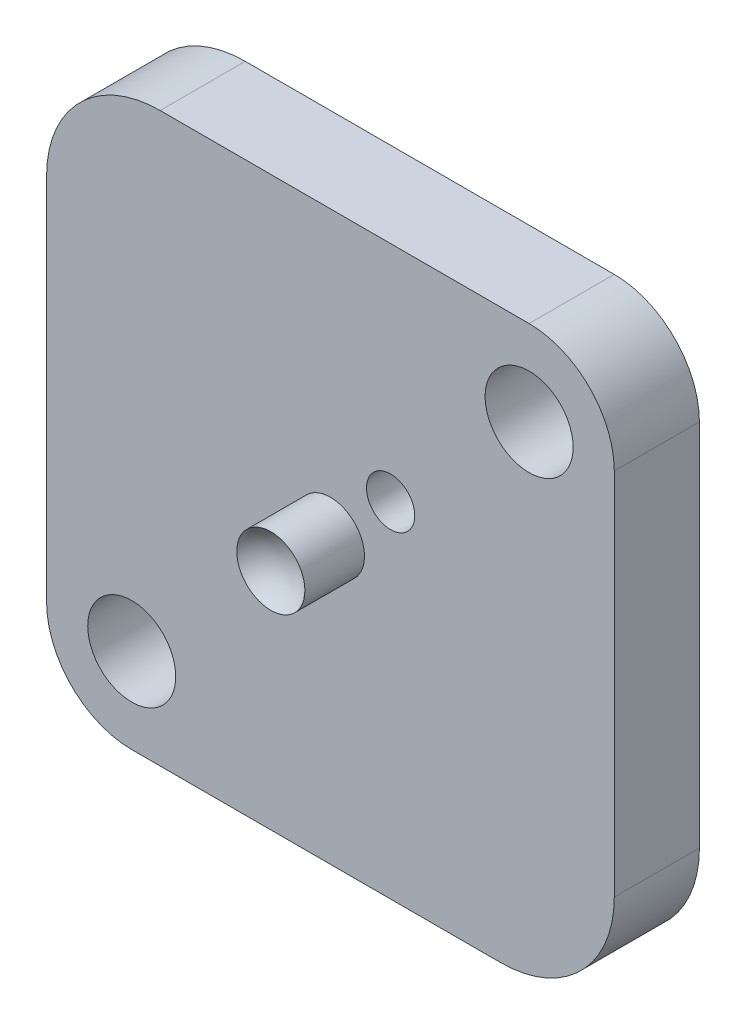
ISO-10303-21;
HEADER;
FILE_DESCRIPTION(('STEP AP214'),'2;1');
FILE_NAME('part.step','',(''),(''),'','','');
FILE_SCHEMA(('AUTOMOTIVE_DESIGN { 1 0 10303 214 1 1 1 1 }'));
ENDSEC;
DATA;
#1=APPLICATION_CONTEXT('core data for automotive mechanical design processes');
#2=APPLICATION_PROTOCOL_DEFINITION('international standard','automotive_design',2000,#1);
#3=PRODUCT_CONTEXT('',#1,'mechanical');
#4=PRODUCT('Part','Part','',(#3));
#5=PRODUCT_RELATED_PRODUCT_CATEGORY('part','',(#4));
#6=PRODUCT_DEFINITION_FORMATION('','',#4);
#7=PRODUCT_DEFINITION_CONTEXT('part definition',#1,'design');
#8=PRODUCT_DEFINITION('design','',#6,#7);
#9=PRODUCT_DEFINITION_SHAPE('','',#8);
#10=(LENGTH_UNIT() NAMED_UNIT(*) SI_UNIT(.MILLI.,.METRE.));
#11=(NAMED_UNIT(*) PLANE_ANGLE_UNIT() SI_UNIT($,.RADIAN.));
#12=(NAMED_UNIT(*) SI_UNIT($,.STERADIAN.) SOLID_ANGLE_UNIT());
#13=UNCERTAINTY_MEASURE_WITH_UNIT(LENGTH_MEASURE(1.E-05),#10,'distance_accuracy_value','');
#14=(GEOMETRIC_REPRESENTATION_CONTEXT(3) GLOBAL_UNCERTAINTY_ASSIGNED_CONTEXT((#13)) GLOBAL_UNIT_ASSIGNED_CONTEXT((#10,
#11,#12)) REPRESENTATION_CONTEXT('',''));
#15=CARTESIAN_POINT('',(0.,0.,0.));
#16=DIRECTION('',(0.,0.,1.));
#17=DIRECTION('',(1.,0.,0.));
#18=AXIS2_PLACEMENT_3D('',#15,#16,#17);
#19=CARTESIAN_POINT('',(-50.,-50.,15.));
#20=DIRECTION('',(1.,0.,0.));
#21=DIRECTION('',(0.,0.,-1.));
#22=AXIS2_PLACEMENT_3D('',#19,#20,#21);
#23=PLANE('',#22);
#24=DIRECTION('',(0.,-1.,0.));
#25=VECTOR('',#24,1.);
#26=CARTESIAN_POINT('',(-50.,-50.,0.));
#27=LINE('',#26,#25);
#28=CARTESIAN_POINT('',(-50.,30.,0.));
#29=VERTEX_POINT('',#28);
#30=CARTESIAN_POINT('',(-50.,-35.,0.));
#31=VERTEX_POINT('',#30);
#32=EDGE_CURVE('E126',#29,#31,#27,.T.);
#33=ORIENTED_EDGE('',*,*,#32,.T.);
#34=DIRECTION('',(0.,0.,-1.));
#35=VECTOR('',#34,1.);
#36=CARTESIAN_POINT('',(-50.,-35.,15.));
#37=LINE('',#36,#35);
#38=CARTESIAN_POINT('',(-50.,-35.,15.));
#39=VERTEX_POINT('',#38);
#40=EDGE_CURVE('E149',#31,#39,#37,.F.);
#41=ORIENTED_EDGE('',*,*,#40,.T.);
#42=DIRECTION('',(0.,-1.,0.));
#43=VECTOR('',#42,1.);
#44=CARTESIAN_POINT('',(-50.,-50.,15.));
#45=LINE('',#44,#43);
#46=CARTESIAN_POINT('',(-50.,30.,15.));
#47=VERTEX_POINT('',#46);
#48=EDGE_CURVE('E124',#47,#39,#45,.T.);
#49=ORIENTED_EDGE('',*,*,#48,.F.);
#50=DIRECTION('',(0.,0.,-1.));
#51=VECTOR('',#50,1.);
#52=CARTESIAN_POINT('',(-50.,30.,15.));
#53=LINE('',#52,#51);
#54=EDGE_CURVE('E137',#47,#29,#53,.T.);
#55=ORIENTED_EDGE('',*,*,#54,.T.);
#56=EDGE_LOOP('',(#33,#41,#49,#55));
#57=FACE_BOUND('',#56,.T.);
#58=ADVANCED_FACE('F34',(#57),#23,.F.);
#59=CARTESIAN_POINT('',(50.,-50.,15.));
#60=DIRECTION('',(0.,1.,0.));
#61=DIRECTION('',(-1.,0.,0.));
#62=AXIS2_PLACEMENT_3D('',#59,#60,#61);
#63=PLANE('',#62);
#64=DIRECTION('',(1.,0.,0.));
#65=VECTOR('',#64,1.);
#66=CARTESIAN_POINT('',(50.,-50.,15.));
#67=LINE('',#66,#65);
#68=CARTESIAN_POINT('',(-35.,-50.,15.));
#69=VERTEX_POINT('',#68);
#70=CARTESIAN_POINT('',(30.,-50.,15.));
#71=VERTEX_POINT('',#70);
#72=EDGE_CURVE('E172',#69,#71,#67,.T.);
#73=ORIENTED_EDGE('',*,*,#72,.F.);
#74=DIRECTION('',(0.,0.,-1.));
#75=VECTOR('',#74,1.);
#76=CARTESIAN_POINT('',(-35.,-50.,15.));
#77=LINE('',#76,#75);
#78=CARTESIAN_POINT('',(-35.,-50.,0.));
#79=VERTEX_POINT('',#78);
#80=EDGE_CURVE('E143',#69,#79,#77,.T.);
#81=ORIENTED_EDGE('',*,*,#80,.T.);
#82=DIRECTION('',(1.,0.,0.));
#83=VECTOR('',#82,1.);
#84=CARTESIAN_POINT('',(50.,-50.,0.));
#85=LINE('',#84,#83);
#86=CARTESIAN_POINT('',(30.,-50.,0.));
#87=VERTEX_POINT('',#86);
#88=EDGE_CURVE('E122',#79,#87,#85,.T.);
#89=ORIENTED_EDGE('',*,*,#88,.T.);
#90=DIRECTION('',(0.,0.,-1.));
#91=VECTOR('',#90,1.);
#92=CARTESIAN_POINT('',(30.,-50.,15.));
#93=LINE('',#92,#91);
#94=EDGE_CURVE('E107',#87,#71,#93,.F.);
#95=ORIENTED_EDGE('',*,*,#94,.T.);
#96=EDGE_LOOP('',(#73,#81,#89,#95));
#97=FACE_BOUND('',#96,.T.);
#98=ADVANCED_FACE('F242',(#97),#63,.F.);
#99=CARTESIAN_POINT('',(50.,-50.,15.));
#100=DIRECTION('',(-1.,0.,0.));
#101=DIRECTION('',(0.,0.,1.));
#102=AXIS2_PLACEMENT_3D('',#99,#100,#101);
#103=PLANE('',#102);
#104=DIRECTION('',(0.,1.,0.));
#105=VECTOR('',#104,1.);
#106=CARTESIAN_POINT('',(50.,-50.,0.));
#107=LINE('',#106,#105);
#108=CARTESIAN_POINT('',(50.,-30.,0.));
#109=VERTEX_POINT('',#108);
#110=CARTESIAN_POINT('',(50.,35.,0.));
#111=VERTEX_POINT('',#110);
#112=EDGE_CURVE('E114',#109,#111,#107,.T.);
#113=ORIENTED_EDGE('',*,*,#112,.T.);
#114=DIRECTION('',(0.,0.,-1.));
#115=VECTOR('',#114,1.);
#116=CARTESIAN_POINT('',(50.,35.,15.));
#117=LINE('',#116,#115);
#118=CARTESIAN_POINT('',(50.,35.,15.));
#119=VERTEX_POINT('',#118);
#120=EDGE_CURVE('E11',#111,#119,#117,.F.);
#121=ORIENTED_EDGE('',*,*,#120,.T.);
#122=DIRECTION('',(0.,1.,0.));
#123=VECTOR('',#122,1.);
#124=CARTESIAN_POINT('',(50.,-50.,15.));
#125=LINE('',#124,#123);
#126=CARTESIAN_POINT('',(50.,-30.,15.));
#127=VERTEX_POINT('',#126);
#128=EDGE_CURVE('E115',#127,#119,#125,.T.);
#129=ORIENTED_EDGE('',*,*,#128,.F.);
#130=DIRECTION('',(0.,0.,-1.));
#131=VECTOR('',#130,1.);
#132=CARTESIAN_POINT('',(50.,-30.,15.));
#133=LINE('',#132,#131);
#134=EDGE_CURVE('E105',#127,#109,#133,.T.);
#135=ORIENTED_EDGE('',*,*,#134,.T.);
#136=EDGE_LOOP('',(#113,#121,#129,#135));
#137=FACE_BOUND('',#136,.T.);
#138=ADVANCED_FACE('F113',(#137),#103,.F.);
#139=CARTESIAN_POINT('',(50.,50.,15.));
#140=DIRECTION('',(0.,-1.,0.));
#141=DIRECTION('',(1.,0.,0.));
#142=AXIS2_PLACEMENT_3D('',#139,#140,#141);
#143=PLANE('',#142);
#144=DIRECTION('',(-1.,0.,0.));
#145=VECTOR('',#144,1.);
#146=CARTESIAN_POINT('',(50.,50.,15.));
#147=LINE('',#146,#145);
#148=CARTESIAN_POINT('',(35.,50.,15.));
#149=VERTEX_POINT('',#148);
#150=CARTESIAN_POINT('',(-30.,50.,15.));
#151=VERTEX_POINT('',#150);
#152=EDGE_CURVE('E116',#149,#151,#147,.T.);
#153=ORIENTED_EDGE('',*,*,#152,.F.);
#154=DIRECTION('',(0.,0.,-1.));
#155=VECTOR('',#154,1.);
#156=CARTESIAN_POINT('',(35.,50.,15.));
#157=LINE('',#156,#155);
#158=CARTESIAN_POINT('',(35.,50.,0.));
#159=VERTEX_POINT('',#158);
#160=EDGE_CURVE('E43',#149,#159,#157,.T.);
#161=ORIENTED_EDGE('',*,*,#160,.T.);
#162=DIRECTION('',(-1.,0.,0.));
#163=VECTOR('',#162,1.);
#164=CARTESIAN_POINT('',(50.,50.,0.));
#165=LINE('',#164,#163);
#166=CARTESIAN_POINT('',(-30.,50.,0.));
#167=VERTEX_POINT('',#166);
#168=EDGE_CURVE('E121',#159,#167,#165,.T.);
#169=ORIENTED_EDGE('',*,*,#168,.T.);
#170=DIRECTION('',(0.,0.,-1.));
#171=VECTOR('',#170,1.);
#172=CARTESIAN_POINT('',(-30.,50.,15.));
#173=LINE('',#172,#171);
#174=EDGE_CURVE('E140',#167,#151,#173,.F.);
#175=ORIENTED_EDGE('',*,*,#174,.T.);
#176=EDGE_LOOP('',(#153,#161,#169,#175));
#177=FACE_BOUND('',#176,.T.);
#178=ADVANCED_FACE('F157',(#177),#143,.F.);
#179=CARTESIAN_POINT('',(0.,0.,15.));
#180=DIRECTION('',(0.,0.,1.));
#181=DIRECTION('',(1.,0.,0.));
#182=AXIS2_PLACEMENT_3D('',#179,#180,#181);
#183=PLANE('',#182);
#184=CARTESIAN_POINT('',(-10.6066017177982,-10.6066017177982,15.));
#185=DIRECTION('',(0.,0.,1.));
#186=DIRECTION('',(-1.,0.,0.));
#187=AXIS2_PLACEMENT_3D('',#184,#185,#186);
#188=CIRCLE('',#187,4.25);
#189=CARTESIAN_POINT('',(-14.8566017177982,-10.6066017177982,15.));
#190=VERTEX_POINT('',#189);
#191=EDGE_CURVE('E202',#190,#190,#188,.T.);
#192=ORIENTED_EDGE('',*,*,#191,.F.);
#193=EDGE_LOOP('',(#192));
#194=FACE_BOUND('',#193,.T.);
#195=CARTESIAN_POINT('',(10.6066017177982,10.6066017177982,15.));
#196=DIRECTION('',(0.,0.,1.));
#197=DIRECTION('',(1.,0.,0.));
#198=AXIS2_PLACEMENT_3D('',#195,#196,#197);
#199=CIRCLE('',#198,4.25);
#200=CARTESIAN_POINT('',(14.8566017177982,10.6066017177982,15.));
#201=VERTEX_POINT('',#200);
#202=EDGE_CURVE('E196',#201,#201,#199,.T.);
#203=ORIENTED_EDGE('',*,*,#202,.F.);
#204=EDGE_LOOP('',(#203));
#205=FACE_BOUND('',#204,.T.);
#206=CARTESIAN_POINT('',(0.,0.,15.));
#207=DIRECTION('',(0.,0.,1.));
#208=DIRECTION('',(1.,0.,0.));
#209=AXIS2_PLACEMENT_3D('',#206,#207,#208);
#210=CIRCLE('',#209,6.);
#211=CARTESIAN_POINT('',(-6.,0.,15.));
#212=VERTEX_POINT('',#211);
#213=EDGE_CURVE('E192',#212,#212,#210,.T.);
#214=ORIENTED_EDGE('',*,*,#213,.F.);
#215=EDGE_LOOP('',(#214));
#216=FACE_BOUND('',#215,.T.);
#217=CARTESIAN_POINT('',(-35.,-35.,15.));
#218=DIRECTION('',(0.,0.,1.));
#219=DIRECTION('',(-1.,0.,0.));
#220=AXIS2_PLACEMENT_3D('',#217,#218,#219);
#221=CIRCLE('',#220,7.75);
#222=CARTESIAN_POINT('',(-42.75,-35.,15.));
#223=VERTEX_POINT('',#222);
#224=EDGE_CURVE('E187',#223,#223,#221,.T.);
#225=ORIENTED_EDGE('',*,*,#224,.F.);
#226=EDGE_LOOP('',(#225));
#227=FACE_BOUND('',#226,.T.);
#228=CARTESIAN_POINT('',(35.,35.,15.));
#229=DIRECTION('',(0.,0.,1.));
#230=DIRECTION('',(1.,0.,0.));
#231=AXIS2_PLACEMENT_3D('',#228,#229,#230);
#232=CIRCLE('',#231,7.75);
#233=CARTESIAN_POINT('',(42.75,35.,15.));
#234=VERTEX_POINT('',#233);
#235=EDGE_CURVE('E176',#234,#234,#232,.T.);
#236=ORIENTED_EDGE('',*,*,#235,.F.);
#237=EDGE_LOOP('',(#236));
#238=FACE_BOUND('',#237,.T.);
#239=ORIENTED_EDGE('',*,*,#48,.T.);
#240=CARTESIAN_POINT('',(-35.,-35.,15.));
#241=DIRECTION('',(0.,0.,1.));
#242=DIRECTION('',(1.,0.,0.));
#243=AXIS2_PLACEMENT_3D('',#240,#241,#242);
#244=CIRCLE('',#243,15.);
#245=EDGE_CURVE('E152',#39,#69,#244,.T.);
#246=ORIENTED_EDGE('',*,*,#245,.T.);
#247=ORIENTED_EDGE('',*,*,#72,.T.);
#248=CARTESIAN_POINT('',(30.,-30.,15.));
#249=DIRECTION('',(0.,0.,1.));
#250=DIRECTION('',(1.,0.,0.));
#251=AXIS2_PLACEMENT_3D('',#248,#249,#250);
#252=CIRCLE('',#251,20.);
#253=EDGE_CURVE('E135',#71,#127,#252,.T.);
#254=ORIENTED_EDGE('',*,*,#253,.T.);
#255=ORIENTED_EDGE('',*,*,#128,.T.);
#256=CARTESIAN_POINT('',(35.,35.,15.));
#257=DIRECTION('',(0.,0.,1.));
#258=DIRECTION('',(1.,0.,0.));
#259=AXIS2_PLACEMENT_3D('',#256,#257,#258);
#260=CIRCLE('',#259,15.);
#261=EDGE_CURVE('E50',#119,#149,#260,.T.);
#262=ORIENTED_EDGE('',*,*,#261,.T.);
#263=ORIENTED_EDGE('',*,*,#152,.T.);
#264=CARTESIAN_POINT('',(-30.,30.,15.));
#265=DIRECTION('',(0.,0.,1.));
#266=DIRECTION('',(1.,0.,0.));
#267=AXIS2_PLACEMENT_3D('',#264,#265,#266);
#268=CIRCLE('',#267,20.);
#269=EDGE_CURVE('E133',#151,#47,#268,.T.);
#270=ORIENTED_EDGE('',*,*,#269,.T.);
#271=EDGE_LOOP('',(#239,#246,#247,#254,#255,#262,#263,#270));
#272=FACE_BOUND('',#271,.T.);
#273=ADVANCED_FACE('F168',(#194,#205,#216,#227,#238,#272),#183,.T.);
#274=CARTESIAN_POINT('',(0.,0.,0.));
#275=DIRECTION('',(0.,0.,1.));
#276=DIRECTION('',(1.,0.,0.));
#277=AXIS2_PLACEMENT_3D('',#274,#275,#276);
#278=PLANE('',#277);
#279=CARTESIAN_POINT('',(-10.6066017177982,-10.6066017177982,0.));
#280=DIRECTION('',(0.,0.,1.));
#281=DIRECTION('',(-1.,0.,0.));
#282=AXIS2_PLACEMENT_3D('',#279,#280,#281);
#283=CIRCLE('',#282,4.25);
#284=CARTESIAN_POINT('',(-14.8566017177982,-10.6066017177982,0.));
#285=VERTEX_POINT('',#284);
#286=EDGE_CURVE('E199',#285,#285,#283,.T.);
#287=ORIENTED_EDGE('',*,*,#286,.T.);
#288=EDGE_LOOP('',(#287));
#289=FACE_BOUND('',#288,.T.);
#290=CARTESIAN_POINT('',(10.6066017177982,10.6066017177982,0.));
#291=DIRECTION('',(0.,0.,1.));
#292=DIRECTION('',(1.,0.,0.));
#293=AXIS2_PLACEMENT_3D('',#290,#291,#292);
#294=CIRCLE('',#293,4.25);
#295=CARTESIAN_POINT('',(14.8566017177982,10.6066017177982,0.));
#296=VERTEX_POINT('',#295);
#297=EDGE_CURVE('E195',#296,#296,#294,.T.);
#298=ORIENTED_EDGE('',*,*,#297,.T.);
#299=EDGE_LOOP('',(#298));
#300=FACE_BOUND('',#299,.T.);
#301=CARTESIAN_POINT('',(-35.,-35.,0.));
#302=DIRECTION('',(0.,0.,1.));
#303=DIRECTION('',(-1.,0.,0.));
#304=AXIS2_PLACEMENT_3D('',#301,#302,#303);
#305=CIRCLE('',#304,7.75);
#306=CARTESIAN_POINT('',(-42.75,-35.,0.));
#307=VERTEX_POINT('',#306);
#308=EDGE_CURVE('E185',#307,#307,#305,.T.);
#309=ORIENTED_EDGE('',*,*,#308,.T.);
#310=EDGE_LOOP('',(#309));
#311=FACE_BOUND('',#310,.T.);
#312=CARTESIAN_POINT('',(35.,35.,0.));
#313=DIRECTION('',(0.,0.,1.));
#314=DIRECTION('',(1.,0.,0.));
#315=AXIS2_PLACEMENT_3D('',#312,#313,#314);
#316=CIRCLE('',#315,7.75);
#317=CARTESIAN_POINT('',(42.75,35.,0.));
#318=VERTEX_POINT('',#317);
#319=EDGE_CURVE('E180',#318,#318,#316,.T.);
#320=ORIENTED_EDGE('',*,*,#319,.T.);
#321=EDGE_LOOP('',(#320));
#322=FACE_BOUND('',#321,.T.);
#323=ORIENTED_EDGE('',*,*,#88,.F.);
#324=CARTESIAN_POINT('',(-35.,-35.,0.));
#325=DIRECTION('',(0.,0.,1.));
#326=DIRECTION('',(1.,0.,0.));
#327=AXIS2_PLACEMENT_3D('',#324,#325,#326);
#328=CIRCLE('',#327,15.);
#329=EDGE_CURVE('E147',#79,#31,#328,.F.);
#330=ORIENTED_EDGE('',*,*,#329,.T.);
#331=ORIENTED_EDGE('',*,*,#32,.F.);
#332=CARTESIAN_POINT('',(-30.,30.,0.));
#333=DIRECTION('',(0.,0.,1.));
#334=DIRECTION('',(1.,0.,0.));
#335=AXIS2_PLACEMENT_3D('',#332,#333,#334);
#336=CIRCLE('',#335,20.);
#337=EDGE_CURVE('E111',#29,#167,#336,.F.);
#338=ORIENTED_EDGE('',*,*,#337,.T.);
#339=ORIENTED_EDGE('',*,*,#168,.F.);
#340=CARTESIAN_POINT('',(35.,35.,0.));
#341=DIRECTION('',(0.,0.,1.));
#342=DIRECTION('',(1.,0.,0.));
#343=AXIS2_PLACEMENT_3D('',#340,#341,#342);
#344=CIRCLE('',#343,15.);
#345=EDGE_CURVE('E120',#159,#111,#344,.F.);
#346=ORIENTED_EDGE('',*,*,#345,.T.);
#347=ORIENTED_EDGE('',*,*,#112,.F.);
#348=CARTESIAN_POINT('',(30.,-30.,0.));
#349=DIRECTION('',(0.,0.,1.));
#350=DIRECTION('',(1.,0.,0.));
#351=AXIS2_PLACEMENT_3D('',#348,#349,#350);
#352=CIRCLE('',#351,20.);
#353=EDGE_CURVE('E101',#109,#87,#352,.F.);
#354=ORIENTED_EDGE('',*,*,#353,.T.);
#355=EDGE_LOOP('',(#323,#330,#331,#338,#339,#346,#347,#354));
#356=FACE_BOUND('',#355,.T.);
#357=ADVANCED_FACE('F118',(#289,#300,#311,#322,#356),#278,.F.);
#358=CARTESIAN_POINT('',(35.,35.,0.));
#359=DIRECTION('',(0.,0.,1.));
#360=DIRECTION('',(1.,0.,0.));
#361=AXIS2_PLACEMENT_3D('',#358,#359,#360);
#362=CYLINDRICAL_SURFACE('',#361,7.75);
#363=ORIENTED_EDGE('',*,*,#319,.F.);
#364=EDGE_LOOP('',(#363));
#365=FACE_BOUND('',#364,.T.);
#366=ORIENTED_EDGE('',*,*,#235,.T.);
#367=EDGE_LOOP('',(#366));
#368=FACE_BOUND('',#367,.T.);
#369=ADVANCED_FACE('F228',(#365,#368),#362,.F.);
#370=CARTESIAN_POINT('',(-35.,-35.,0.));
#371=DIRECTION('',(0.,0.,1.));
#372=DIRECTION('',(1.,0.,0.));
#373=AXIS2_PLACEMENT_3D('',#370,#371,#372);
#374=CYLINDRICAL_SURFACE('',#373,7.75);
#375=ORIENTED_EDGE('',*,*,#308,.F.);
#376=EDGE_LOOP('',(#375));
#377=FACE_BOUND('',#376,.T.);
#378=ORIENTED_EDGE('',*,*,#224,.T.);
#379=EDGE_LOOP('',(#378));
#380=FACE_BOUND('',#379,.T.);
#381=ADVANCED_FACE('F230',(#377,#380),#374,.F.);
#382=CARTESIAN_POINT('',(0.,0.,25.5));
#383=DIRECTION('',(0.,0.,-1.));
#384=DIRECTION('',(-1.,0.,0.));
#385=AXIS2_PLACEMENT_3D('',#382,#383,#384);
#386=CYLINDRICAL_SURFACE('',#385,6.);
#387=CARTESIAN_POINT('',(0.,0.,25.5));
#388=DIRECTION('',(0.,0.,1.));
#389=DIRECTION('',(1.,0.,0.));
#390=AXIS2_PLACEMENT_3D('',#387,#388,#389);
#391=CIRCLE('',#390,6.);
#392=CARTESIAN_POINT('',(-6.,0.,25.5));
#393=VERTEX_POINT('',#392);
#394=EDGE_CURVE('E38',#393,#393,#391,.T.);
#395=CARTESIAN_POINT('',(-6.,0.,25.5));
#396=CARTESIAN_POINT('',(-6.,0.,25.390625));
#397=CARTESIAN_POINT('',(-6.,0.,25.28125));
#398=CARTESIAN_POINT('',(-6.,0.,25.0625));
#399=CARTESIAN_POINT('',(-6.,0.,24.953125));
#400=CARTESIAN_POINT('',(-6.,0.,24.734375));
#401=CARTESIAN_POINT('',(-6.,0.,24.625));
#402=CARTESIAN_POINT('',(-6.,0.,24.40625));
#403=CARTESIAN_POINT('',(-6.,0.,24.296875));
#404=CARTESIAN_POINT('',(-6.,0.,24.078125));
#405=CARTESIAN_POINT('',(-6.,0.,23.96875));
#406=CARTESIAN_POINT('',(-6.,0.,23.75));
#407=CARTESIAN_POINT('',(-6.,0.,23.640625));
#408=CARTESIAN_POINT('',(-6.,0.,23.421875));
#409=CARTESIAN_POINT('',(-6.,0.,23.3125));
#410=CARTESIAN_POINT('',(-6.,0.,23.09375));
#411=CARTESIAN_POINT('',(-6.,0.,22.984375));
#412=CARTESIAN_POINT('',(-6.,0.,22.765625));
#413=CARTESIAN_POINT('',(-6.,0.,22.65625));
#414=CARTESIAN_POINT('',(-6.,0.,22.4375));
#415=CARTESIAN_POINT('',(-6.,0.,22.328125));
#416=CARTESIAN_POINT('',(-6.,0.,22.109375));
#417=CARTESIAN_POINT('',(-6.,0.,22.));
#418=CARTESIAN_POINT('',(-6.,0.,21.78125));
#419=CARTESIAN_POINT('',(-6.,0.,21.671875));
#420=CARTESIAN_POINT('',(-6.,0.,21.453125));
#421=CARTESIAN_POINT('',(-6.,0.,21.34375));
#422=CARTESIAN_POINT('',(-6.,0.,21.125));
#423=CARTESIAN_POINT('',(-6.,0.,21.015625));
#424=CARTESIAN_POINT('',(-6.,0.,20.796875));
#425=CARTESIAN_POINT('',(-6.,0.,20.6875));
#426=CARTESIAN_POINT('',(-6.,0.,20.46875));
#427=CARTESIAN_POINT('',(-6.,0.,20.359375));
#428=CARTESIAN_POINT('',(-6.,0.,20.140625));
#429=CARTESIAN_POINT('',(-6.,0.,20.03125));
#430=CARTESIAN_POINT('',(-6.,0.,19.8125));
#431=CARTESIAN_POINT('',(-6.,0.,19.703125));
#432=CARTESIAN_POINT('',(-6.,0.,19.484375));
#433=CARTESIAN_POINT('',(-6.,0.,19.375));
#434=CARTESIAN_POINT('',(-6.,0.,19.15625));
#435=CARTESIAN_POINT('',(-6.,0.,19.046875));
#436=CARTESIAN_POINT('',(-6.,0.,18.828125));
#437=CARTESIAN_POINT('',(-6.,0.,18.71875));
#438=CARTESIAN_POINT('',(-6.,0.,18.5));
#439=CARTESIAN_POINT('',(-6.,0.,18.390625));
#440=CARTESIAN_POINT('',(-6.,0.,18.171875));
#441=CARTESIAN_POINT('',(-6.,0.,18.0625));
#442=CARTESIAN_POINT('',(-6.,0.,17.84375));
#443=CARTESIAN_POINT('',(-6.,0.,17.734375));
#444=CARTESIAN_POINT('',(-6.,0.,17.515625));
#445=CARTESIAN_POINT('',(-6.,0.,17.40625));
#446=CARTESIAN_POINT('',(-6.,0.,17.1875));
#447=CARTESIAN_POINT('',(-6.,0.,17.078125));
#448=CARTESIAN_POINT('',(-6.,0.,16.859375));
#449=CARTESIAN_POINT('',(-6.,0.,16.75));
#450=CARTESIAN_POINT('',(-6.,0.,16.53125));
#451=CARTESIAN_POINT('',(-6.,0.,16.421875));
#452=CARTESIAN_POINT('',(-6.,0.,16.203125));
#453=CARTESIAN_POINT('',(-6.,0.,16.09375));
#454=CARTESIAN_POINT('',(-6.,0.,15.875));
#455=CARTESIAN_POINT('',(-6.,0.,15.765625));
#456=CARTESIAN_POINT('',(-6.,0.,15.546875));
#457=CARTESIAN_POINT('',(-6.,0.,15.4375));
#458=CARTESIAN_POINT('',(-6.,0.,15.21875));
#459=CARTESIAN_POINT('',(-6.,0.,15.109375));
#460=CARTESIAN_POINT('',(-6.,0.,15.));
#461=B_SPLINE_CURVE_WITH_KNOTS('',3,(#395,#396,#397,#398,#399,#400,#401,#402,#403,#404,#405,
#406,#407,#408,#409,#410,#411,#412,#413,#414,#415,#416,#417,#418,#419,#420,#421,#422,#423,#424,
#425,#426,#427,#428,#429,#430,#431,#432,#433,#434,#435,#436,#437,#438,#439,#440,#441,#442,#443,
#444,#445,#446,#447,#448,#449,#450,#451,#452,#453,#454,#455,#456,#457,#458,#459,#460),
.UNSPECIFIED.,.F.,.F.,(4,2,2,2,2,2,2,2,2,2,2,2,2,2,2,2,2,2,2,2,2,2,2,2,2,2,2,2,2,2,2,2,4),(0.,
0.328125000000002,0.656250000000001,0.984375000000003,1.3125,1.640625,1.96875,2.296875,2.625,
2.953125,3.28125,3.609375,3.9375,4.265625,4.59375,4.921875,5.25,5.578125,5.90625,6.234375,
6.5625,6.890625,7.21875,7.54687500000001,7.875,8.20312500000001,8.53125,8.859375,9.1875,
9.515625,9.84375000000001,10.171875,10.5),.UNSPECIFIED.);
#462=EDGE_CURVE('BSEAM237',#393,#212,#461,.T.);
#463=ORIENTED_EDGE('',*,*,#394,.F.);
#464=ORIENTED_EDGE('',*,*,#213,.T.);
#465=ORIENTED_EDGE('',*,*,#462,.T.);
#466=ORIENTED_EDGE('',*,*,#462,.F.);
#467=EDGE_LOOP('',(#463,#465,#464,#466));
#468=FACE_BOUND('',#467,.T.);
#469=ADVANCED_FACE('F237',(#468),#386,.T.);
#470=CARTESIAN_POINT('',(0.,0.,30.));
#471=DIRECTION('',(0.,0.,1.));
#472=DIRECTION('',(1.,0.,0.));
#473=AXIS2_PLACEMENT_3D('',#470,#471,#472);
#474=SPHERICAL_SURFACE('',#473,7.5);
#475=ORIENTED_EDGE('',*,*,#394,.T.);
#476=EDGE_LOOP('',(#475));
#477=FACE_BOUND('',#476,.T.);
#478=ADVANCED_FACE('F36',(#477),#474,.F.);
#479=CARTESIAN_POINT('',(10.6066017177982,10.6066017177982,0.));
#480=DIRECTION('',(0.,0.,1.));
#481=DIRECTION('',(1.,0.,0.));
#482=AXIS2_PLACEMENT_3D('',#479,#480,#481);
#483=CYLINDRICAL_SURFACE('',#482,4.25);
#484=ORIENTED_EDGE('',*,*,#297,.F.);
#485=EDGE_LOOP('',(#484));
#486=FACE_BOUND('',#485,.T.);
#487=ORIENTED_EDGE('',*,*,#202,.T.);
#488=EDGE_LOOP('',(#487));
#489=FACE_BOUND('',#488,.T.);
#490=ADVANCED_FACE('F213',(#486,#489),#483,.F.);
#491=CARTESIAN_POINT('',(-10.6066017177982,-10.6066017177982,0.));
#492=DIRECTION('',(0.,0.,1.));
#493=DIRECTION('',(1.,0.,0.));
#494=AXIS2_PLACEMENT_3D('',#491,#492,#493);
#495=CYLINDRICAL_SURFACE('',#494,4.25);
#496=ORIENTED_EDGE('',*,*,#286,.F.);
#497=EDGE_LOOP('',(#496));
#498=FACE_BOUND('',#497,.T.);
#499=ORIENTED_EDGE('',*,*,#191,.T.);
#500=EDGE_LOOP('',(#499));
#501=FACE_BOUND('',#500,.T.);
#502=ADVANCED_FACE('F210',(#498,#501),#495,.F.);
#503=CARTESIAN_POINT('',(30.,-30.,15.));
#504=DIRECTION('',(0.,0.,-1.));
#505=DIRECTION('',(-1.,0.,0.));
#506=AXIS2_PLACEMENT_3D('',#503,#504,#505);
#507=CYLINDRICAL_SURFACE('',#506,20.);
#508=ORIENTED_EDGE('',*,*,#253,.F.);
#509=ORIENTED_EDGE('',*,*,#94,.F.);
#510=ORIENTED_EDGE('',*,*,#353,.F.);
#511=ORIENTED_EDGE('',*,*,#134,.F.);
#512=EDGE_LOOP('',(#508,#509,#510,#511));
#513=FACE_BOUND('',#512,.T.);
#514=ADVANCED_FACE('F104',(#513),#507,.T.);
#515=CARTESIAN_POINT('',(-30.,30.,15.));
#516=DIRECTION('',(0.,0.,-1.));
#517=DIRECTION('',(-1.,0.,0.));
#518=AXIS2_PLACEMENT_3D('',#515,#516,#517);
#519=CYLINDRICAL_SURFACE('',#518,20.);
#520=ORIENTED_EDGE('',*,*,#269,.F.);
#521=ORIENTED_EDGE('',*,*,#174,.F.);
#522=ORIENTED_EDGE('',*,*,#337,.F.);
#523=ORIENTED_EDGE('',*,*,#54,.F.);
#524=EDGE_LOOP('',(#520,#521,#522,#523));
#525=FACE_BOUND('',#524,.T.);
#526=ADVANCED_FACE('F165',(#525),#519,.T.);
#527=CARTESIAN_POINT('',(-35.,-35.,15.));
#528=DIRECTION('',(0.,0.,-1.));
#529=DIRECTION('',(-1.,0.,0.));
#530=AXIS2_PLACEMENT_3D('',#527,#528,#529);
#531=CYLINDRICAL_SURFACE('',#530,15.);
#532=ORIENTED_EDGE('',*,*,#245,.F.);
#533=ORIENTED_EDGE('',*,*,#40,.F.);
#534=ORIENTED_EDGE('',*,*,#329,.F.);
#535=ORIENTED_EDGE('',*,*,#80,.F.);
#536=EDGE_LOOP('',(#532,#533,#534,#535));
#537=FACE_BOUND('',#536,.T.);
#538=ADVANCED_FACE('F255',(#537),#531,.T.);
#539=CARTESIAN_POINT('',(35.,35.,15.));
#540=DIRECTION('',(0.,0.,-1.));
#541=DIRECTION('',(-1.,0.,0.));
#542=AXIS2_PLACEMENT_3D('',#539,#540,#541);
#543=CYLINDRICAL_SURFACE('',#542,15.);
#544=ORIENTED_EDGE('',*,*,#261,.F.);
#545=ORIENTED_EDGE('',*,*,#120,.F.);
#546=ORIENTED_EDGE('',*,*,#345,.F.);
#547=ORIENTED_EDGE('',*,*,#160,.F.);
#548=EDGE_LOOP('',(#544,#545,#546,#547));
#549=FACE_BOUND('',#548,.T.);
#550=ADVANCED_FACE('F257',(#549),#543,.T.);
#551=CLOSED_SHELL('',(#58,#98,#138,#178,#273,#357,#369,#381,#469,#478,#490,#502,#514,#526,#538,#550));
#552=MANIFOLD_SOLID_BREP('B2',#551);
#553=ADVANCED_BREP_SHAPE_REPRESENTATION('',(#18,#552),#14);
#554=SHAPE_DEFINITION_REPRESENTATION(#9,#553);
ENDSEC;
END-ISO-10303-21;
